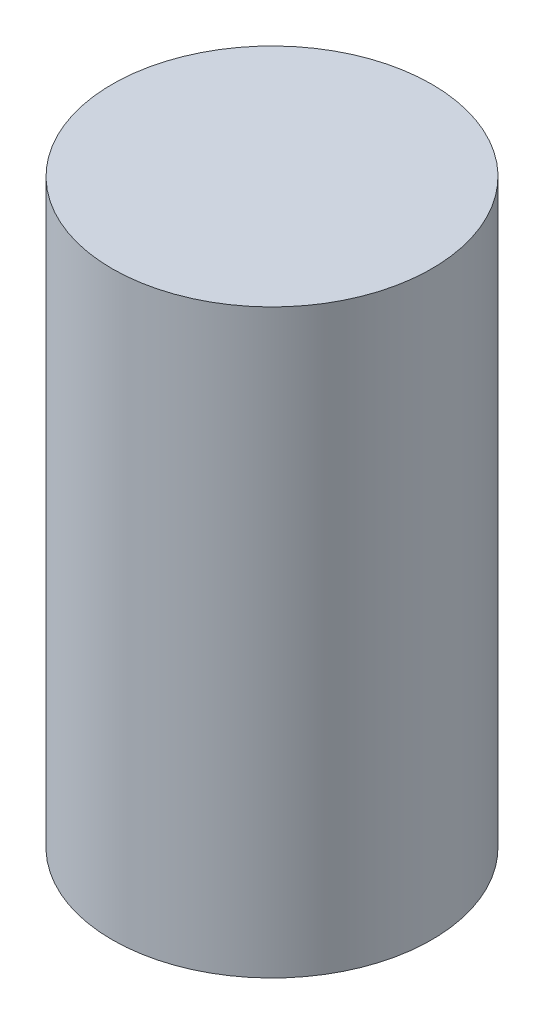
ISO-10303-21;
HEADER;
FILE_DESCRIPTION(('STEP AP214'),'2;1');
FILE_NAME('part.step','',(''),(''),'','','');
FILE_SCHEMA(('AUTOMOTIVE_DESIGN { 1 0 10303 214 1 1 1 1 }'));
ENDSEC;
DATA;
#1=APPLICATION_CONTEXT('core data for automotive mechanical design processes');
#2=APPLICATION_PROTOCOL_DEFINITION('international standard','automotive_design',2000,#1);
#3=PRODUCT_CONTEXT('',#1,'mechanical');
#4=PRODUCT('Part','Part','',(#3));
#5=PRODUCT_RELATED_PRODUCT_CATEGORY('part','',(#4));
#6=PRODUCT_DEFINITION_FORMATION('','',#4);
#7=PRODUCT_DEFINITION_CONTEXT('part definition',#1,'design');
#8=PRODUCT_DEFINITION('design','',#6,#7);
#9=PRODUCT_DEFINITION_SHAPE('','',#8);
#10=(LENGTH_UNIT() NAMED_UNIT(*) SI_UNIT(.MILLI.,.METRE.));
#11=(NAMED_UNIT(*) PLANE_ANGLE_UNIT() SI_UNIT($,.RADIAN.));
#12=(NAMED_UNIT(*) SI_UNIT($,.STERADIAN.) SOLID_ANGLE_UNIT());
#13=UNCERTAINTY_MEASURE_WITH_UNIT(LENGTH_MEASURE(1.E-05),#10,'distance_accuracy_value','');
#14=(GEOMETRIC_REPRESENTATION_CONTEXT(3) GLOBAL_UNCERTAINTY_ASSIGNED_CONTEXT((#13)) GLOBAL_UNIT_ASSIGNED_CONTEXT((#10,
#11,#12)) REPRESENTATION_CONTEXT('',''));
#15=CARTESIAN_POINT('',(0.,0.,0.));
#16=DIRECTION('',(0.,0.,1.));
#17=DIRECTION('',(1.,0.,0.));
#18=AXIS2_PLACEMENT_3D('',#15,#16,#17);
#19=CARTESIAN_POINT('',(0.,50.,0.));
#20=DIRECTION('',(0.,-1.,0.));
#21=DIRECTION('',(0.,0.,-1.));
#22=AXIS2_PLACEMENT_3D('',#19,#20,#21);
#23=CYLINDRICAL_SURFACE('',#22,13.75);
#24=CARTESIAN_POINT('',(0.,50.,0.));
#25=DIRECTION('',(0.,1.,0.));
#26=DIRECTION('',(0.,0.,1.));
#27=AXIS2_PLACEMENT_3D('',#24,#25,#26);
#28=CIRCLE('',#27,13.75);
#29=CARTESIAN_POINT('',(0.,50.,13.75));
#30=VERTEX_POINT('',#29);
#31=EDGE_CURVE('E10',#30,#30,#28,.T.);
#32=ORIENTED_EDGE('',*,*,#31,.F.);
#33=EDGE_LOOP('',(#32));
#34=FACE_BOUND('',#33,.T.);
#35=CARTESIAN_POINT('',(0.,0.,0.));
#36=DIRECTION('',(0.,1.,0.));
#37=DIRECTION('',(0.,0.,1.));
#38=AXIS2_PLACEMENT_3D('',#35,#36,#37);
#39=CIRCLE('',#38,13.75);
#40=CARTESIAN_POINT('',(0.,0.,13.75));
#41=VERTEX_POINT('',#40);
#42=EDGE_CURVE('E40',#41,#41,#39,.T.);
#43=ORIENTED_EDGE('',*,*,#42,.T.);
#44=EDGE_LOOP('',(#43));
#45=FACE_BOUND('',#44,.T.);
#46=ADVANCED_FACE('F37',(#34,#45),#23,.T.);
#47=CARTESIAN_POINT('',(0.,50.,0.));
#48=DIRECTION('',(0.,1.,0.));
#49=DIRECTION('',(0.,0.,1.));
#50=AXIS2_PLACEMENT_3D('',#47,#48,#49);
#51=PLANE('',#50);
#52=ORIENTED_EDGE('',*,*,#31,.T.);
#53=EDGE_LOOP('',(#52));
#54=FACE_BOUND('',#53,.T.);
#55=ADVANCED_FACE('F54',(#54),#51,.T.);
#56=CARTESIAN_POINT('',(0.,0.,0.));
#57=DIRECTION('',(0.,1.,0.));
#58=DIRECTION('',(0.,0.,1.));
#59=AXIS2_PLACEMENT_3D('',#56,#57,#58);
#60=PLANE('',#59);
#61=ORIENTED_EDGE('',*,*,#42,.F.);
#62=EDGE_LOOP('',(#61));
#63=FACE_BOUND('',#62,.T.);
#64=ADVANCED_FACE('F52',(#63),#60,.F.);
#65=CLOSED_SHELL('',(#46,#55,#64));
#66=MANIFOLD_SOLID_BREP('B2',#65);
#67=ADVANCED_BREP_SHAPE_REPRESENTATION('',(#18,#66),#14);
#68=SHAPE_DEFINITION_REPRESENTATION(#9,#67);
ENDSEC;
END-ISO-10303-21;
